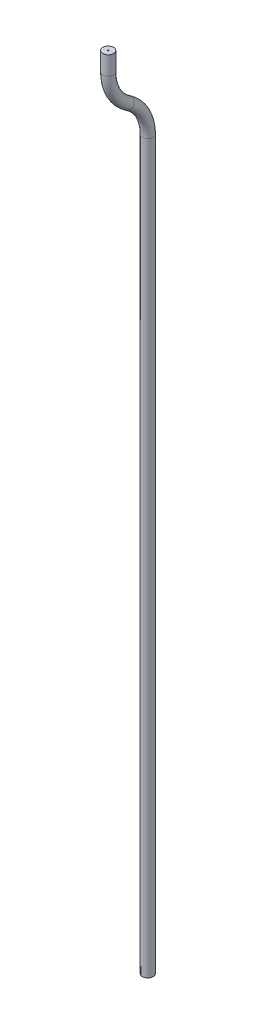
ISO-10303-21;
HEADER;
FILE_DESCRIPTION(('STEP AP214'),'2;1');
FILE_NAME('part.step','',(''),(''),'','','');
FILE_SCHEMA(('AUTOMOTIVE_DESIGN { 1 0 10303 214 1 1 1 1 }'));
ENDSEC;
DATA;
#1=APPLICATION_CONTEXT('core data for automotive mechanical design processes');
#2=APPLICATION_PROTOCOL_DEFINITION('international standard','automotive_design',2000,#1);
#3=PRODUCT_CONTEXT('',#1,'mechanical');
#4=PRODUCT('Part','Part','',(#3));
#5=PRODUCT_RELATED_PRODUCT_CATEGORY('part','',(#4));
#6=PRODUCT_DEFINITION_FORMATION('','',#4);
#7=PRODUCT_DEFINITION_CONTEXT('part definition',#1,'design');
#8=PRODUCT_DEFINITION('design','',#6,#7);
#9=PRODUCT_DEFINITION_SHAPE('','',#8);
#10=(LENGTH_UNIT() NAMED_UNIT(*) SI_UNIT(.MILLI.,.METRE.));
#11=(NAMED_UNIT(*) PLANE_ANGLE_UNIT() SI_UNIT($,.RADIAN.));
#12=(NAMED_UNIT(*) SI_UNIT($,.STERADIAN.) SOLID_ANGLE_UNIT());
#13=UNCERTAINTY_MEASURE_WITH_UNIT(LENGTH_MEASURE(1.E-05),#10,'distance_accuracy_value','');
#14=(GEOMETRIC_REPRESENTATION_CONTEXT(3) GLOBAL_UNCERTAINTY_ASSIGNED_CONTEXT((#13)) GLOBAL_UNIT_ASSIGNED_CONTEXT((#10,
#11,#12)) REPRESENTATION_CONTEXT('',''));
#15=CARTESIAN_POINT('',(0.,0.,0.));
#16=DIRECTION('',(0.,0.,1.));
#17=DIRECTION('',(1.,0.,0.));
#18=AXIS2_PLACEMENT_3D('',#15,#16,#17);
#19=CARTESIAN_POINT('',(0.,0.,17.35));
#20=DIRECTION('',(0.,-1.,0.));
#21=DIRECTION('',(0.,0.,-1.));
#22=AXIS2_PLACEMENT_3D('',#19,#20,#21);
#23=CYLINDRICAL_SURFACE('',#22,1.75);
#24=CARTESIAN_POINT('',(0.,-6.,17.35));
#25=DIRECTION('',(0.,1.,0.));
#26=DIRECTION('',(0.,0.,1.));
#27=AXIS2_PLACEMENT_3D('',#24,#25,#26);
#28=CIRCLE('',#27,1.75);
#29=CARTESIAN_POINT('',(0.,-6.,19.1));
#30=VERTEX_POINT('',#29);
#31=EDGE_CURVE('E59',#30,#30,#28,.T.);
#32=ORIENTED_EDGE('',*,*,#31,.T.);
#33=EDGE_LOOP('',(#32));
#34=FACE_BOUND('',#33,.T.);
#35=CARTESIAN_POINT('',(0.,0.,17.35));
#36=DIRECTION('',(0.,1.,0.));
#37=DIRECTION('',(0.,0.,1.));
#38=AXIS2_PLACEMENT_3D('',#35,#36,#37);
#39=CIRCLE('',#38,1.75);
#40=CARTESIAN_POINT('',(0.,0.,19.1));
#41=VERTEX_POINT('',#40);
#42=EDGE_CURVE('E56',#41,#41,#39,.T.);
#43=ORIENTED_EDGE('',*,*,#42,.F.);
#44=EDGE_LOOP('',(#43));
#45=FACE_BOUND('',#44,.T.);
#46=ADVANCED_FACE('F35',(#34,#45),#23,.T.);
#47=CARTESIAN_POINT('',(0.,-5.99999999999999,2.93127431906612));
#48=DIRECTION('',(1.,0.,0.));
#49=DIRECTION('',(0.,0.,-1.));
#50=AXIS2_PLACEMENT_3D('',#47,#48,#49);
#51=TOROIDAL_SURFACE('',#50,14.4187256809339,1.75);
#52=CARTESIAN_POINT('',(0.,-18.,10.925));
#53=DIRECTION('',(0.,0.554398901666056,0.832251078600365));
#54=DIRECTION('',(0.,-0.832251078600365,0.554398901666056));
#55=AXIS2_PLACEMENT_3D('',#52,#53,#54);
#56=CIRCLE('',#55,1.75);
#57=CARTESIAN_POINT('',(0.,-19.4564393875506,11.8951980779156));
#58=VERTEX_POINT('',#57);
#59=EDGE_CURVE('E61',#58,#58,#56,.T.);
#60=CARTESIAN_POINT('',(0.,-5.99999999999999,2.93127431906612));
#61=DIRECTION('',(1.,0.,0.));
#62=DIRECTION('',(0.,0.,-1.));
#63=AXIS2_PLACEMENT_3D('',#60,#61,#62);
#64=CIRCLE('',#63,16.1687256809339);
#65=EDGE_CURVE('',#30,#58,#64,.T.);
#66=ORIENTED_EDGE('',*,*,#31,.F.);
#67=ORIENTED_EDGE('',*,*,#59,.T.);
#68=ORIENTED_EDGE('',*,*,#65,.T.);
#69=ORIENTED_EDGE('',*,*,#65,.F.);
#70=EDGE_LOOP('',(#66,#68,#67,#69));
#71=FACE_BOUND('',#70,.T.);
#72=ADVANCED_FACE('F81',(#71),#51,.T.);
#73=CARTESIAN_POINT('',(0.,-30.,18.9187256809339));
#74=DIRECTION('',(-1.,0.,0.));
#75=DIRECTION('',(0.,0.,1.));
#76=AXIS2_PLACEMENT_3D('',#73,#74,#75);
#77=TOROIDAL_SURFACE('',#76,14.4187256809339,1.75);
#78=CARTESIAN_POINT('',(0.,-30.,4.5));
#79=DIRECTION('',(0.,1.,0.));
#80=DIRECTION('',(0.,0.,1.));
#81=AXIS2_PLACEMENT_3D('',#78,#79,#80);
#82=CIRCLE('',#81,1.75);
#83=CARTESIAN_POINT('',(0.,-30.,6.25));
#84=VERTEX_POINT('',#83);
#85=EDGE_CURVE('E39',#84,#84,#82,.T.);
#86=ORIENTED_EDGE('',*,*,#85,.T.);
#87=EDGE_LOOP('',(#86));
#88=FACE_BOUND('',#87,.T.);
#89=ORIENTED_EDGE('',*,*,#59,.F.);
#90=EDGE_LOOP('',(#89));
#91=FACE_BOUND('',#90,.T.);
#92=ADVANCED_FACE('F68',(#88,#91),#77,.T.);
#93=CARTESIAN_POINT('',(0.,-30.,4.5));
#94=DIRECTION('',(0.,-1.,0.));
#95=DIRECTION('',(0.,0.,-1.));
#96=AXIS2_PLACEMENT_3D('',#93,#94,#95);
#97=CYLINDRICAL_SURFACE('',#96,1.75);
#98=CARTESIAN_POINT('',(0.,-266.,4.5));
#99=DIRECTION('',(0.,1.,0.));
#100=DIRECTION('',(0.,0.,1.));
#101=AXIS2_PLACEMENT_3D('',#98,#99,#100);
#102=CIRCLE('',#101,1.75);
#103=CARTESIAN_POINT('',(0.,-266.,6.25));
#104=VERTEX_POINT('',#103);
#105=EDGE_CURVE('E52',#104,#104,#102,.T.);
#106=ORIENTED_EDGE('',*,*,#105,.T.);
#107=EDGE_LOOP('',(#106));
#108=FACE_BOUND('',#107,.T.);
#109=ORIENTED_EDGE('',*,*,#85,.F.);
#110=EDGE_LOOP('',(#109));
#111=FACE_BOUND('',#110,.T.);
#112=ADVANCED_FACE('F37',(#108,#111),#97,.T.);
#113=CARTESIAN_POINT('',(0.,0.,17.35));
#114=DIRECTION('',(0.,1.,0.));
#115=DIRECTION('',(0.,0.,1.));
#116=AXIS2_PLACEMENT_3D('',#113,#114,#115);
#117=PLANE('',#116);
#118=CARTESIAN_POINT('',(0.,0.,17.35));
#119=DIRECTION('',(0.,1.,0.));
#120=DIRECTION('',(0.,0.,1.));
#121=AXIS2_PLACEMENT_3D('',#118,#119,#120);
#122=CIRCLE('',#121,0.18);
#123=CARTESIAN_POINT('',(0.,0.,17.53));
#124=VERTEX_POINT('',#123);
#125=EDGE_CURVE('E55',#124,#124,#122,.F.);
#126=ORIENTED_EDGE('',*,*,#125,.T.);
#127=EDGE_LOOP('',(#126));
#128=FACE_BOUND('',#127,.T.);
#129=ORIENTED_EDGE('',*,*,#42,.T.);
#130=EDGE_LOOP('',(#129));
#131=FACE_BOUND('',#130,.T.);
#132=ADVANCED_FACE('F72',(#128,#131),#117,.T.);
#133=CARTESIAN_POINT('',(0.,-266.,4.5));
#134=DIRECTION('',(0.,1.,0.));
#135=DIRECTION('',(0.,0.,1.));
#136=AXIS2_PLACEMENT_3D('',#133,#134,#135);
#137=PLANE('',#136);
#138=CARTESIAN_POINT('',(0.,-266.,4.5));
#139=DIRECTION('',(0.,1.,0.));
#140=DIRECTION('',(0.,0.,1.));
#141=AXIS2_PLACEMENT_3D('',#138,#139,#140);
#142=CIRCLE('',#141,0.18);
#143=CARTESIAN_POINT('',(0.,-266.,4.68));
#144=VERTEX_POINT('',#143);
#145=EDGE_CURVE('E10',#144,#144,#142,.F.);
#146=ORIENTED_EDGE('',*,*,#145,.F.);
#147=EDGE_LOOP('',(#146));
#148=FACE_BOUND('',#147,.T.);
#149=ORIENTED_EDGE('',*,*,#105,.F.);
#150=EDGE_LOOP('',(#149));
#151=FACE_BOUND('',#150,.T.);
#152=ADVANCED_FACE('F78',(#148,#151),#137,.F.);
#153=CARTESIAN_POINT('',(0.,0.,17.35));
#154=DIRECTION('',(0.,-1.,0.));
#155=DIRECTION('',(0.,0.,-1.));
#156=AXIS2_PLACEMENT_3D('',#153,#154,#155);
#157=CYLINDRICAL_SURFACE('',#156,0.18);
#158=CARTESIAN_POINT('',(0.,-6.,17.35));
#159=DIRECTION('',(0.,1.,0.));
#160=DIRECTION('',(0.,0.,1.));
#161=AXIS2_PLACEMENT_3D('',#158,#159,#160);
#162=CIRCLE('',#161,0.18);
#163=CARTESIAN_POINT('',(0.,-6.,17.53));
#164=VERTEX_POINT('',#163);
#165=EDGE_CURVE('E168',#164,#164,#162,.F.);
#166=ORIENTED_EDGE('',*,*,#165,.T.);
#167=EDGE_LOOP('',(#166));
#168=FACE_BOUND('',#167,.T.);
#169=ORIENTED_EDGE('',*,*,#125,.F.);
#170=EDGE_LOOP('',(#169));
#171=FACE_BOUND('',#170,.T.);
#172=ADVANCED_FACE('F96',(#168,#171),#157,.F.);
#173=CARTESIAN_POINT('',(0.,-5.99999999999999,2.93127431906612));
#174=DIRECTION('',(1.,0.,0.));
#175=DIRECTION('',(0.,0.,-1.));
#176=AXIS2_PLACEMENT_3D('',#173,#174,#175);
#177=TOROIDAL_SURFACE('',#176,14.4187256809339,0.18);
#178=CARTESIAN_POINT('',(0.,-18.,10.925));
#179=DIRECTION('',(0.,0.554398901666056,0.832251078600365));
#180=DIRECTION('',(0.,-0.832251078600365,0.554398901666056));
#181=AXIS2_PLACEMENT_3D('',#178,#179,#180);
#182=CIRCLE('',#181,0.18);
#183=CARTESIAN_POINT('',(0.,-18.1498051941481,11.0247918022999));
#184=VERTEX_POINT('',#183);
#185=EDGE_CURVE('E48',#184,#184,#182,.F.);
#186=CARTESIAN_POINT('',(0.,-5.99999999999999,2.93127431906612));
#187=DIRECTION('',(1.,0.,0.));
#188=DIRECTION('',(0.,0.,-1.));
#189=AXIS2_PLACEMENT_3D('',#186,#187,#188);
#190=CIRCLE('',#189,14.5987256809339);
#191=EDGE_CURVE('',#164,#184,#190,.T.);
#192=ORIENTED_EDGE('',*,*,#165,.F.);
#193=ORIENTED_EDGE('',*,*,#185,.T.);
#194=ORIENTED_EDGE('',*,*,#191,.T.);
#195=ORIENTED_EDGE('',*,*,#191,.F.);
#196=EDGE_LOOP('',(#192,#194,#193,#195));
#197=FACE_BOUND('',#196,.T.);
#198=ADVANCED_FACE('F89',(#197),#177,.F.);
#199=CARTESIAN_POINT('',(0.,-30.,18.9187256809339));
#200=DIRECTION('',(-1.,0.,0.));
#201=DIRECTION('',(0.,0.,1.));
#202=AXIS2_PLACEMENT_3D('',#199,#200,#201);
#203=TOROIDAL_SURFACE('',#202,14.4187256809339,0.18);
#204=CARTESIAN_POINT('',(0.,-30.,4.5));
#205=DIRECTION('',(0.,1.,0.));
#206=DIRECTION('',(0.,0.,1.));
#207=AXIS2_PLACEMENT_3D('',#204,#205,#206);
#208=CIRCLE('',#207,0.18);
#209=CARTESIAN_POINT('',(0.,-30.,4.68));
#210=VERTEX_POINT('',#209);
#211=EDGE_CURVE('E43',#210,#210,#208,.F.);
#212=ORIENTED_EDGE('',*,*,#211,.T.);
#213=EDGE_LOOP('',(#212));
#214=FACE_BOUND('',#213,.T.);
#215=ORIENTED_EDGE('',*,*,#185,.F.);
#216=EDGE_LOOP('',(#215));
#217=FACE_BOUND('',#216,.T.);
#218=ADVANCED_FACE('F84',(#214,#217),#203,.F.);
#219=CARTESIAN_POINT('',(0.,-30.,4.5));
#220=DIRECTION('',(0.,-1.,0.));
#221=DIRECTION('',(0.,0.,-1.));
#222=AXIS2_PLACEMENT_3D('',#219,#220,#221);
#223=CYLINDRICAL_SURFACE('',#222,0.18);
#224=ORIENTED_EDGE('',*,*,#145,.T.);
#225=EDGE_LOOP('',(#224));
#226=FACE_BOUND('',#225,.T.);
#227=ORIENTED_EDGE('',*,*,#211,.F.);
#228=EDGE_LOOP('',(#227));
#229=FACE_BOUND('',#228,.T.);
#230=ADVANCED_FACE('F82',(#226,#229),#223,.F.);
#231=CLOSED_SHELL('',(#46,#72,#92,#112,#132,#152,#172,#198,#218,#230));
#232=MANIFOLD_SOLID_BREP('B2',#231);
#233=ADVANCED_BREP_SHAPE_REPRESENTATION('',(#18,#232),#14);
#234=SHAPE_DEFINITION_REPRESENTATION(#9,#233);
ENDSEC;
END-ISO-10303-21;
